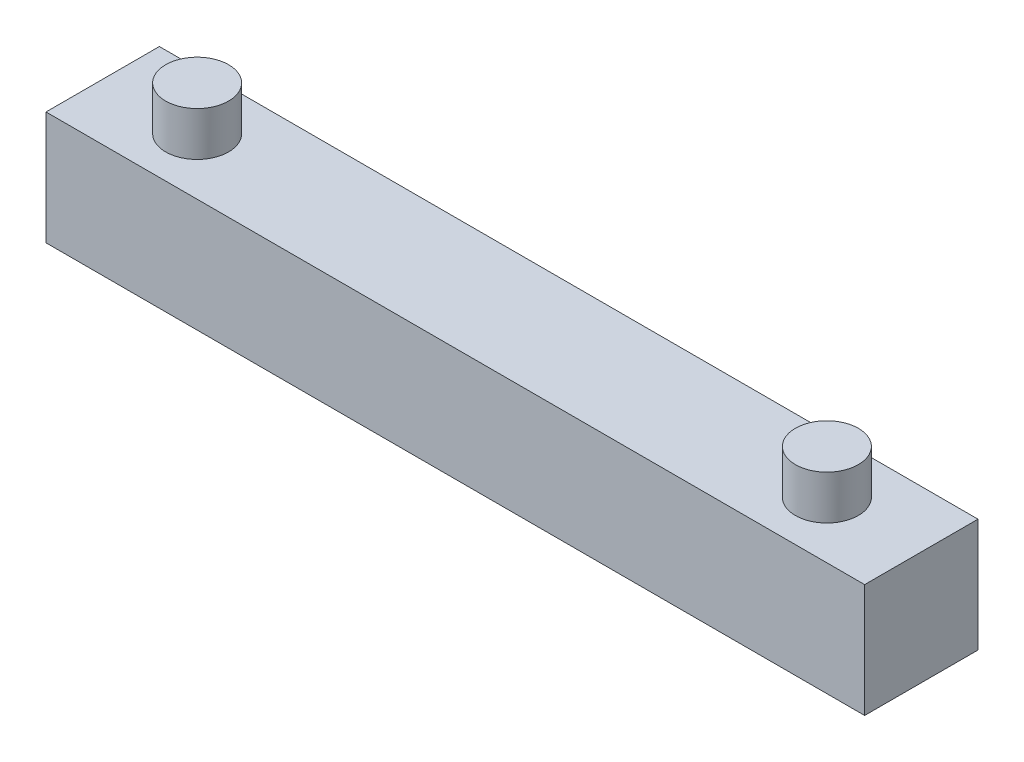
ISO-10303-21;
HEADER;
FILE_DESCRIPTION(('STEP AP214'),'2;1');
FILE_NAME('part.step','',(''),(''),'','','');
FILE_SCHEMA(('AUTOMOTIVE_DESIGN { 1 0 10303 214 1 1 1 1 }'));
ENDSEC;
DATA;
#1=APPLICATION_CONTEXT('core data for automotive mechanical design processes');
#2=APPLICATION_PROTOCOL_DEFINITION('international standard','automotive_design',2000,#1);
#3=PRODUCT_CONTEXT('',#1,'mechanical');
#4=PRODUCT('Part','Part','',(#3));
#5=PRODUCT_RELATED_PRODUCT_CATEGORY('part','',(#4));
#6=PRODUCT_DEFINITION_FORMATION('','',#4);
#7=PRODUCT_DEFINITION_CONTEXT('part definition',#1,'design');
#8=PRODUCT_DEFINITION('design','',#6,#7);
#9=PRODUCT_DEFINITION_SHAPE('','',#8);
#10=(LENGTH_UNIT() NAMED_UNIT(*) SI_UNIT(.MILLI.,.METRE.));
#11=(NAMED_UNIT(*) PLANE_ANGLE_UNIT() SI_UNIT($,.RADIAN.));
#12=(NAMED_UNIT(*) SI_UNIT($,.STERADIAN.) SOLID_ANGLE_UNIT());
#13=UNCERTAINTY_MEASURE_WITH_UNIT(LENGTH_MEASURE(1.E-05),#10,'distance_accuracy_value','');
#14=(GEOMETRIC_REPRESENTATION_CONTEXT(3) GLOBAL_UNCERTAINTY_ASSIGNED_CONTEXT((#13)) GLOBAL_UNIT_ASSIGNED_CONTEXT((#10,
#11,#12)) REPRESENTATION_CONTEXT('',''));
#15=CARTESIAN_POINT('',(0.,0.,0.));
#16=DIRECTION('',(0.,0.,1.));
#17=DIRECTION('',(1.,0.,0.));
#18=AXIS2_PLACEMENT_3D('',#15,#16,#17);
#19=CARTESIAN_POINT('',(-32.5,9.,4.5));
#20=DIRECTION('',(1.,0.,0.));
#21=DIRECTION('',(0.,0.,-1.));
#22=AXIS2_PLACEMENT_3D('',#19,#20,#21);
#23=PLANE('',#22);
#24=DIRECTION('',(0.,0.,1.));
#25=VECTOR('',#24,1.);
#26=CARTESIAN_POINT('',(-32.5,0.,4.5));
#27=LINE('',#26,#25);
#28=CARTESIAN_POINT('',(-32.5,0.,-4.5));
#29=VERTEX_POINT('',#28);
#30=CARTESIAN_POINT('',(-32.5,0.,4.5));
#31=VERTEX_POINT('',#30);
#32=EDGE_CURVE('E101',#29,#31,#27,.T.);
#33=ORIENTED_EDGE('',*,*,#32,.T.);
#34=DIRECTION('',(0.,-1.,0.));
#35=VECTOR('',#34,1.);
#36=CARTESIAN_POINT('',(-32.5,9.,4.5));
#37=LINE('',#36,#35);
#38=CARTESIAN_POINT('',(-32.5,9.,4.5));
#39=VERTEX_POINT('',#38);
#40=EDGE_CURVE('E92',#39,#31,#37,.T.);
#41=ORIENTED_EDGE('',*,*,#40,.F.);
#42=DIRECTION('',(0.,0.,1.));
#43=VECTOR('',#42,1.);
#44=CARTESIAN_POINT('',(-32.5,9.,4.5));
#45=LINE('',#44,#43);
#46=CARTESIAN_POINT('',(-32.5,9.,-4.5));
#47=VERTEX_POINT('',#46);
#48=EDGE_CURVE('E86',#47,#39,#45,.T.);
#49=ORIENTED_EDGE('',*,*,#48,.F.);
#50=DIRECTION('',(0.,-1.,0.));
#51=VECTOR('',#50,1.);
#52=CARTESIAN_POINT('',(-32.5,9.,-4.5));
#53=LINE('',#52,#51);
#54=EDGE_CURVE('E97',#47,#29,#53,.T.);
#55=ORIENTED_EDGE('',*,*,#54,.T.);
#56=EDGE_LOOP('',(#33,#41,#49,#55));
#57=FACE_BOUND('',#56,.T.);
#58=ADVANCED_FACE('F34',(#57),#23,.F.);
#59=CARTESIAN_POINT('',(32.5,9.,4.5));
#60=DIRECTION('',(0.,0.,-1.));
#61=DIRECTION('',(-1.,0.,0.));
#62=AXIS2_PLACEMENT_3D('',#59,#60,#61);
#63=PLANE('',#62);
#64=DIRECTION('',(1.,0.,0.));
#65=VECTOR('',#64,1.);
#66=CARTESIAN_POINT('',(32.5,0.,4.5));
#67=LINE('',#66,#65);
#68=CARTESIAN_POINT('',(32.5,0.,4.5));
#69=VERTEX_POINT('',#68);
#70=EDGE_CURVE('E91',#31,#69,#67,.T.);
#71=ORIENTED_EDGE('',*,*,#70,.T.);
#72=DIRECTION('',(0.,-1.,0.));
#73=VECTOR('',#72,1.);
#74=CARTESIAN_POINT('',(32.5,9.,4.5));
#75=LINE('',#74,#73);
#76=CARTESIAN_POINT('',(32.5,9.,4.5));
#77=VERTEX_POINT('',#76);
#78=EDGE_CURVE('E89',#77,#69,#75,.T.);
#79=ORIENTED_EDGE('',*,*,#78,.F.);
#80=DIRECTION('',(1.,0.,0.));
#81=VECTOR('',#80,1.);
#82=CARTESIAN_POINT('',(32.5,9.,4.5));
#83=LINE('',#82,#81);
#84=EDGE_CURVE('E81',#39,#77,#83,.T.);
#85=ORIENTED_EDGE('',*,*,#84,.F.);
#86=ORIENTED_EDGE('',*,*,#40,.T.);
#87=EDGE_LOOP('',(#71,#79,#85,#86));
#88=FACE_BOUND('',#87,.T.);
#89=ADVANCED_FACE('F90',(#88),#63,.F.);
#90=CARTESIAN_POINT('',(32.5,9.,-4.5));
#91=DIRECTION('',(-1.,0.,0.));
#92=DIRECTION('',(0.,0.,1.));
#93=AXIS2_PLACEMENT_3D('',#90,#91,#92);
#94=PLANE('',#93);
#95=DIRECTION('',(0.,0.,-1.));
#96=VECTOR('',#95,1.);
#97=CARTESIAN_POINT('',(32.5,0.,-4.5));
#98=LINE('',#97,#96);
#99=CARTESIAN_POINT('',(32.5,0.,-4.5));
#100=VERTEX_POINT('',#99);
#101=EDGE_CURVE('E67',#69,#100,#98,.T.);
#102=ORIENTED_EDGE('',*,*,#101,.T.);
#103=DIRECTION('',(0.,-1.,0.));
#104=VECTOR('',#103,1.);
#105=CARTESIAN_POINT('',(32.5,9.,-4.5));
#106=LINE('',#105,#104);
#107=CARTESIAN_POINT('',(32.5,9.,-4.5));
#108=VERTEX_POINT('',#107);
#109=EDGE_CURVE('E93',#108,#100,#106,.T.);
#110=ORIENTED_EDGE('',*,*,#109,.F.);
#111=DIRECTION('',(0.,0.,-1.));
#112=VECTOR('',#111,1.);
#113=CARTESIAN_POINT('',(32.5,9.,-4.5));
#114=LINE('',#113,#112);
#115=EDGE_CURVE('E84',#77,#108,#114,.T.);
#116=ORIENTED_EDGE('',*,*,#115,.F.);
#117=ORIENTED_EDGE('',*,*,#78,.T.);
#118=EDGE_LOOP('',(#102,#110,#116,#117));
#119=FACE_BOUND('',#118,.T.);
#120=ADVANCED_FACE('F95',(#119),#94,.F.);
#121=CARTESIAN_POINT('',(-32.5,9.,-4.5));
#122=DIRECTION('',(0.,0.,1.));
#123=DIRECTION('',(1.,0.,0.));
#124=AXIS2_PLACEMENT_3D('',#121,#122,#123);
#125=PLANE('',#124);
#126=DIRECTION('',(-1.,0.,0.));
#127=VECTOR('',#126,1.);
#128=CARTESIAN_POINT('',(-32.5,0.,-4.5));
#129=LINE('',#128,#127);
#130=EDGE_CURVE('E73',#100,#29,#129,.T.);
#131=ORIENTED_EDGE('',*,*,#130,.T.);
#132=ORIENTED_EDGE('',*,*,#54,.F.);
#133=DIRECTION('',(-1.,0.,0.));
#134=VECTOR('',#133,1.);
#135=CARTESIAN_POINT('',(-32.5,9.,-4.5));
#136=LINE('',#135,#134);
#137=EDGE_CURVE('E50',#108,#47,#136,.T.);
#138=ORIENTED_EDGE('',*,*,#137,.F.);
#139=ORIENTED_EDGE('',*,*,#109,.T.);
#140=EDGE_LOOP('',(#131,#132,#138,#139));
#141=FACE_BOUND('',#140,.T.);
#142=ADVANCED_FACE('F117',(#141),#125,.F.);
#143=CARTESIAN_POINT('',(0.,9.,0.));
#144=DIRECTION('',(0.,-1.,0.));
#145=DIRECTION('',(0.,0.,-1.));
#146=AXIS2_PLACEMENT_3D('',#143,#144,#145);
#147=PLANE('',#146);
#148=CARTESIAN_POINT('',(-25.,9.,0.));
#149=DIRECTION('',(0.,-1.,0.));
#150=DIRECTION('',(0.,0.,-1.));
#151=AXIS2_PLACEMENT_3D('',#148,#149,#150);
#152=CIRCLE('',#151,2.5);
#153=CARTESIAN_POINT('',(-25.,9.,-2.5));
#154=VERTEX_POINT('',#153);
#155=EDGE_CURVE('E11',#154,#154,#152,.F.);
#156=ORIENTED_EDGE('',*,*,#155,.F.);
#157=EDGE_LOOP('',(#156));
#158=FACE_BOUND('',#157,.T.);
#159=CARTESIAN_POINT('',(25.,9.,0.));
#160=DIRECTION('',(0.,-1.,0.));
#161=DIRECTION('',(0.,0.,-1.));
#162=AXIS2_PLACEMENT_3D('',#159,#160,#161);
#163=CIRCLE('',#162,2.5);
#164=CARTESIAN_POINT('',(25.,9.,-2.5));
#165=VERTEX_POINT('',#164);
#166=EDGE_CURVE('E42',#165,#165,#163,.F.);
#167=ORIENTED_EDGE('',*,*,#166,.F.);
#168=EDGE_LOOP('',(#167));
#169=FACE_BOUND('',#168,.T.);
#170=ORIENTED_EDGE('',*,*,#48,.T.);
#171=ORIENTED_EDGE('',*,*,#84,.T.);
#172=ORIENTED_EDGE('',*,*,#115,.T.);
#173=ORIENTED_EDGE('',*,*,#137,.T.);
#174=EDGE_LOOP('',(#170,#171,#172,#173));
#175=FACE_BOUND('',#174,.T.);
#176=ADVANCED_FACE('F82',(#158,#169,#175),#147,.F.);
#177=CARTESIAN_POINT('',(0.,0.,0.));
#178=DIRECTION('',(0.,-1.,0.));
#179=DIRECTION('',(0.,0.,-1.));
#180=AXIS2_PLACEMENT_3D('',#177,#178,#179);
#181=PLANE('',#180);
#182=ORIENTED_EDGE('',*,*,#32,.F.);
#183=ORIENTED_EDGE('',*,*,#130,.F.);
#184=ORIENTED_EDGE('',*,*,#101,.F.);
#185=ORIENTED_EDGE('',*,*,#70,.F.);
#186=EDGE_LOOP('',(#182,#183,#184,#185));
#187=FACE_BOUND('',#186,.T.);
#188=ADVANCED_FACE('F116',(#187),#181,.T.);
#189=CARTESIAN_POINT('',(25.,12.5,0.));
#190=DIRECTION('',(0.,-1.,0.));
#191=DIRECTION('',(0.,0.,-1.));
#192=AXIS2_PLACEMENT_3D('',#189,#190,#191);
#193=CYLINDRICAL_SURFACE('',#192,2.5);
#194=CARTESIAN_POINT('',(25.,12.5,0.));
#195=DIRECTION('',(0.,1.,0.));
#196=DIRECTION('',(0.,0.,1.));
#197=AXIS2_PLACEMENT_3D('',#194,#195,#196);
#198=CIRCLE('',#197,2.5);
#199=CARTESIAN_POINT('',(25.,12.5,2.5));
#200=VERTEX_POINT('',#199);
#201=EDGE_CURVE('E104',#200,#200,#198,.T.);
#202=ORIENTED_EDGE('',*,*,#201,.F.);
#203=EDGE_LOOP('',(#202));
#204=FACE_BOUND('',#203,.T.);
#205=ORIENTED_EDGE('',*,*,#166,.T.);
#206=EDGE_LOOP('',(#205));
#207=FACE_BOUND('',#206,.T.);
#208=ADVANCED_FACE('F113',(#204,#207),#193,.T.);
#209=CARTESIAN_POINT('',(0.,12.5,0.));
#210=DIRECTION('',(0.,1.,0.));
#211=DIRECTION('',(0.,0.,1.));
#212=AXIS2_PLACEMENT_3D('',#209,#210,#211);
#213=PLANE('',#212);
#214=ORIENTED_EDGE('',*,*,#201,.T.);
#215=EDGE_LOOP('',(#214));
#216=FACE_BOUND('',#215,.T.);
#217=ADVANCED_FACE('F147',(#216),#213,.T.);
#218=CARTESIAN_POINT('',(-25.,12.5,0.));
#219=DIRECTION('',(0.,-1.,0.));
#220=DIRECTION('',(0.,0.,-1.));
#221=AXIS2_PLACEMENT_3D('',#218,#219,#220);
#222=CYLINDRICAL_SURFACE('',#221,2.5);
#223=CARTESIAN_POINT('',(-25.,12.5,0.));
#224=DIRECTION('',(0.,1.,0.));
#225=DIRECTION('',(0.,0.,1.));
#226=AXIS2_PLACEMENT_3D('',#223,#224,#225);
#227=CIRCLE('',#226,2.5);
#228=CARTESIAN_POINT('',(-25.,12.5,2.5));
#229=VERTEX_POINT('',#228);
#230=EDGE_CURVE('E138',#229,#229,#227,.T.);
#231=ORIENTED_EDGE('',*,*,#230,.F.);
#232=EDGE_LOOP('',(#231));
#233=FACE_BOUND('',#232,.T.);
#234=ORIENTED_EDGE('',*,*,#155,.T.);
#235=EDGE_LOOP('',(#234));
#236=FACE_BOUND('',#235,.T.);
#237=ADVANCED_FACE('F144',(#233,#236),#222,.T.);
#238=CARTESIAN_POINT('',(0.,12.5,0.));
#239=DIRECTION('',(0.,1.,0.));
#240=DIRECTION('',(0.,0.,1.));
#241=AXIS2_PLACEMENT_3D('',#238,#239,#240);
#242=PLANE('',#241);
#243=ORIENTED_EDGE('',*,*,#230,.T.);
#244=EDGE_LOOP('',(#243));
#245=FACE_BOUND('',#244,.T.);
#246=ADVANCED_FACE('F142',(#245),#242,.T.);
#247=CLOSED_SHELL('',(#58,#89,#120,#142,#176,#188,#208,#217,#237,#246));
#248=MANIFOLD_SOLID_BREP('B2',#247);
#249=ADVANCED_BREP_SHAPE_REPRESENTATION('',(#18,#248),#14);
#250=SHAPE_DEFINITION_REPRESENTATION(#9,#249);
ENDSEC;
END-ISO-10303-21;
